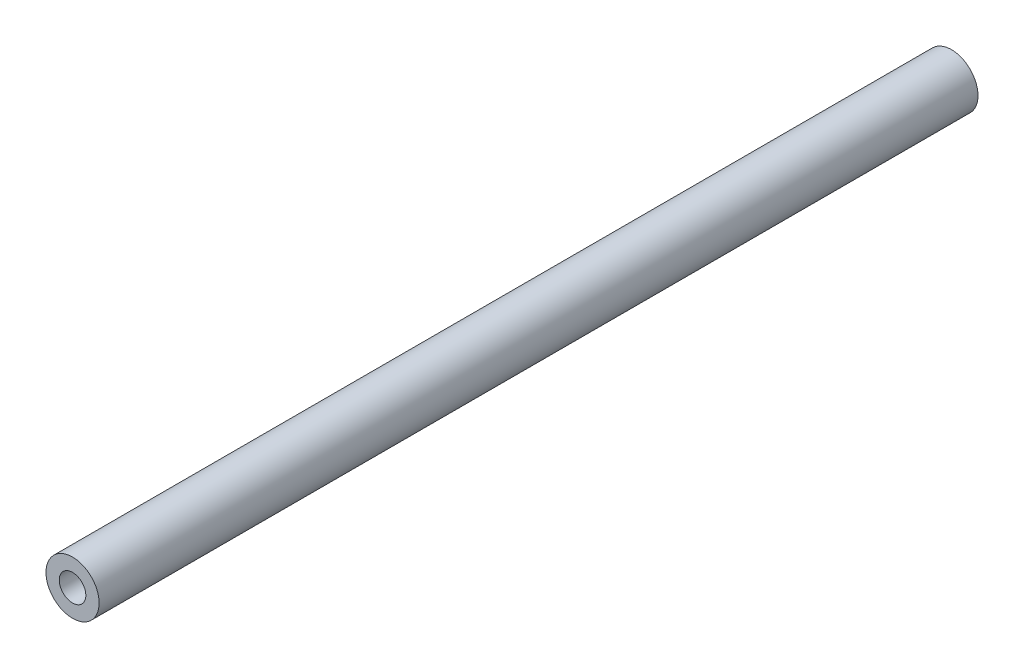
ISO-10303-21;
HEADER;
FILE_DESCRIPTION(('STEP AP214'),'2;1');
FILE_NAME('part.step','',(''),(''),'','','');
FILE_SCHEMA(('AUTOMOTIVE_DESIGN { 1 0 10303 214 1 1 1 1 }'));
ENDSEC;
DATA;
#1=APPLICATION_CONTEXT('core data for automotive mechanical design processes');
#2=APPLICATION_PROTOCOL_DEFINITION('international standard','automotive_design',2000,#1);
#3=PRODUCT_CONTEXT('',#1,'mechanical');
#4=PRODUCT('Part','Part','',(#3));
#5=PRODUCT_RELATED_PRODUCT_CATEGORY('part','',(#4));
#6=PRODUCT_DEFINITION_FORMATION('','',#4);
#7=PRODUCT_DEFINITION_CONTEXT('part definition',#1,'design');
#8=PRODUCT_DEFINITION('design','',#6,#7);
#9=PRODUCT_DEFINITION_SHAPE('','',#8);
#10=(LENGTH_UNIT() NAMED_UNIT(*) SI_UNIT(.MILLI.,.METRE.));
#11=(NAMED_UNIT(*) PLANE_ANGLE_UNIT() SI_UNIT($,.RADIAN.));
#12=(NAMED_UNIT(*) SI_UNIT($,.STERADIAN.) SOLID_ANGLE_UNIT());
#13=UNCERTAINTY_MEASURE_WITH_UNIT(LENGTH_MEASURE(1.E-05),#10,'distance_accuracy_value','');
#14=(GEOMETRIC_REPRESENTATION_CONTEXT(3) GLOBAL_UNCERTAINTY_ASSIGNED_CONTEXT((#13)) GLOBAL_UNIT_ASSIGNED_CONTEXT((#10,
#11,#12)) REPRESENTATION_CONTEXT('',''));
#15=CARTESIAN_POINT('',(0.,0.,0.));
#16=DIRECTION('',(0.,0.,1.));
#17=DIRECTION('',(1.,0.,0.));
#18=AXIS2_PLACEMENT_3D('',#15,#16,#17);
#19=CARTESIAN_POINT('',(0.,6.35,3810.));
#20=DIRECTION('',(0.,0.,-1.));
#21=DIRECTION('',(0.,1.,0.));
#22=AXIS2_PLACEMENT_3D('',#19,#20,#21);
#23=PLANE('',#22);
#24=CARTESIAN_POINT('',(0.,0.,3810.));
#25=DIRECTION('',(0.,0.,1.));
#26=DIRECTION('',(0.,-1.,0.));
#27=AXIS2_PLACEMENT_3D('',#24,#25,#26);
#28=CIRCLE('',#27,3.175);
#29=CARTESIAN_POINT('',(0.,-3.175,3810.));
#30=VERTEX_POINT('',#29);
#31=EDGE_CURVE('E37',#30,#30,#28,.T.);
#32=ORIENTED_EDGE('',*,*,#31,.F.);
#33=EDGE_LOOP('',(#32));
#34=FACE_BOUND('',#33,.T.);
#35=CARTESIAN_POINT('',(0.,0.,3810.));
#36=DIRECTION('',(0.,0.,1.));
#37=DIRECTION('',(0.,-1.,0.));
#38=AXIS2_PLACEMENT_3D('',#35,#36,#37);
#39=CIRCLE('',#38,6.35);
#40=CARTESIAN_POINT('',(0.,-6.35,3810.));
#41=VERTEX_POINT('',#40);
#42=EDGE_CURVE('E41',#41,#41,#39,.T.);
#43=ORIENTED_EDGE('',*,*,#42,.T.);
#44=EDGE_LOOP('',(#43));
#45=FACE_BOUND('',#44,.T.);
#46=ADVANCED_FACE('F31',(#34,#45),#23,.F.);
#47=CARTESIAN_POINT('',(0.,0.,3810.));
#48=DIRECTION('',(0.,0.,1.));
#49=DIRECTION('',(0.,-1.,0.));
#50=AXIS2_PLACEMENT_3D('',#47,#48,#49);
#51=CYLINDRICAL_SURFACE('',#50,3.175);
#52=CARTESIAN_POINT('',(0.,0.,3599.88303957966));
#53=DIRECTION('',(0.,0.,1.));
#54=DIRECTION('',(1.,0.,0.));
#55=AXIS2_PLACEMENT_3D('',#52,#53,#54);
#56=CIRCLE('',#55,3.175);
#57=CARTESIAN_POINT('',(3.175,0.,3599.88303957966));
#58=VERTEX_POINT('',#57);
#59=EDGE_CURVE('E45',#58,#58,#56,.F.);
#60=ORIENTED_EDGE('',*,*,#59,.T.);
#61=EDGE_LOOP('',(#60));
#62=FACE_BOUND('',#61,.T.);
#63=ORIENTED_EDGE('',*,*,#31,.T.);
#64=EDGE_LOOP('',(#63));
#65=FACE_BOUND('',#64,.T.);
#66=ADVANCED_FACE('F51',(#62,#65),#51,.F.);
#67=CARTESIAN_POINT('',(0.,0.,3810.));
#68=DIRECTION('',(0.,0.,1.));
#69=DIRECTION('',(0.,-1.,0.));
#70=AXIS2_PLACEMENT_3D('',#67,#68,#69);
#71=CYLINDRICAL_SURFACE('',#70,6.35);
#72=ORIENTED_EDGE('',*,*,#42,.F.);
#73=EDGE_LOOP('',(#72));
#74=FACE_BOUND('',#73,.T.);
#75=CARTESIAN_POINT('',(0.,0.,3599.88303957966));
#76=DIRECTION('',(0.,0.,1.));
#77=DIRECTION('',(1.,0.,0.));
#78=AXIS2_PLACEMENT_3D('',#75,#76,#77);
#79=CIRCLE('',#78,6.35);
#80=CARTESIAN_POINT('',(6.35,0.,3599.88303957966));
#81=VERTEX_POINT('',#80);
#82=EDGE_CURVE('E10',#81,#81,#79,.T.);
#83=ORIENTED_EDGE('',*,*,#82,.T.);
#84=EDGE_LOOP('',(#83));
#85=FACE_BOUND('',#84,.T.);
#86=ADVANCED_FACE('F55',(#74,#85),#71,.T.);
#87=CARTESIAN_POINT('',(-631.178411958842,-6.35,3599.88303957966));
#88=DIRECTION('',(0.,0.,1.));
#89=DIRECTION('',(1.,0.,0.));
#90=AXIS2_PLACEMENT_3D('',#87,#88,#89);
#91=PLANE('',#90);
#92=ORIENTED_EDGE('',*,*,#82,.F.);
#93=EDGE_LOOP('',(#92));
#94=FACE_BOUND('',#93,.T.);
#95=ORIENTED_EDGE('',*,*,#59,.F.);
#96=EDGE_LOOP('',(#95));
#97=FACE_BOUND('',#96,.T.);
#98=ADVANCED_FACE('F53',(#94,#97),#91,.F.);
#99=CLOSED_SHELL('',(#46,#66,#86,#98));
#100=MANIFOLD_SOLID_BREP('B2',#99);
#101=ADVANCED_BREP_SHAPE_REPRESENTATION('',(#18,#100),#14);
#102=SHAPE_DEFINITION_REPRESENTATION(#9,#101);
ENDSEC;
END-ISO-10303-21;
